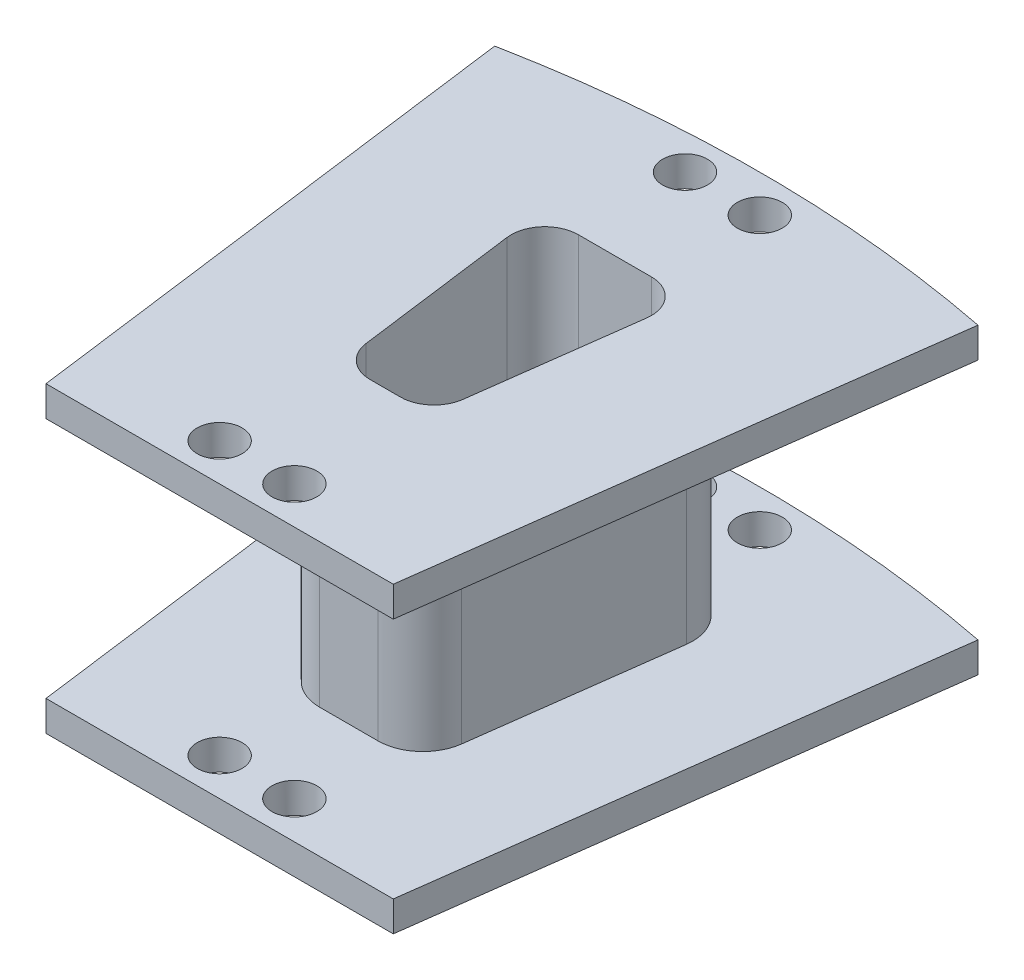
ISO-10303-21;
HEADER;
FILE_DESCRIPTION(('STEP AP214'),'2;1');
FILE_NAME('part.step','',(''),(''),'','','');
FILE_SCHEMA(('AUTOMOTIVE_DESIGN { 1 0 10303 214 1 1 1 1 }'));
ENDSEC;
DATA;
#1=APPLICATION_CONTEXT('core data for automotive mechanical design processes');
#2=APPLICATION_PROTOCOL_DEFINITION('international standard','automotive_design',2000,#1);
#3=PRODUCT_CONTEXT('',#1,'mechanical');
#4=PRODUCT('Part','Part','',(#3));
#5=PRODUCT_RELATED_PRODUCT_CATEGORY('part','',(#4));
#6=PRODUCT_DEFINITION_FORMATION('','',#4);
#7=PRODUCT_DEFINITION_CONTEXT('part definition',#1,'design');
#8=PRODUCT_DEFINITION('design','',#6,#7);
#9=PRODUCT_DEFINITION_SHAPE('','',#8);
#10=(LENGTH_UNIT() NAMED_UNIT(*) SI_UNIT(.MILLI.,.METRE.));
#11=(NAMED_UNIT(*) PLANE_ANGLE_UNIT() SI_UNIT($,.RADIAN.));
#12=(NAMED_UNIT(*) SI_UNIT($,.STERADIAN.) SOLID_ANGLE_UNIT());
#13=UNCERTAINTY_MEASURE_WITH_UNIT(LENGTH_MEASURE(1.E-05),#10,'distance_accuracy_value','');
#14=(GEOMETRIC_REPRESENTATION_CONTEXT(3) GLOBAL_UNCERTAINTY_ASSIGNED_CONTEXT((#13)) GLOBAL_UNIT_ASSIGNED_CONTEXT((#10,
#11,#12)) REPRESENTATION_CONTEXT('',''));
#15=CARTESIAN_POINT('',(0.,0.,0.));
#16=DIRECTION('',(0.,0.,1.));
#17=DIRECTION('',(1.,0.,0.));
#18=AXIS2_PLACEMENT_3D('',#15,#16,#17);
#19=CARTESIAN_POINT('',(0.,29.4,64.5794683780643));
#20=DIRECTION('',(0.,-1.,0.));
#21=DIRECTION('',(0.,0.,-1.));
#22=AXIS2_PLACEMENT_3D('',#19,#20,#21);
#23=PLANE('',#22);
#24=CARTESIAN_POINT('',(-2.5,29.4,-16.8905316219357));
#25=DIRECTION('',(0.,-1.,0.));
#26=DIRECTION('',(0.,0.,-1.));
#27=AXIS2_PLACEMENT_3D('',#24,#25,#26);
#28=CIRCLE('',#27,1.5);
#29=CARTESIAN_POINT('',(-2.5,29.4,-18.3905316219357));
#30=VERTEX_POINT('',#29);
#31=EDGE_CURVE('E240',#30,#30,#28,.T.);
#32=ORIENTED_EDGE('',*,*,#31,.T.);
#33=EDGE_LOOP('',(#32));
#34=FACE_BOUND('',#33,.T.);
#35=CARTESIAN_POINT('',(2.5,29.4,-16.8905316219357));
#36=DIRECTION('',(0.,-1.,0.));
#37=DIRECTION('',(0.,0.,-1.));
#38=AXIS2_PLACEMENT_3D('',#35,#36,#37);
#39=CIRCLE('',#38,1.5);
#40=CARTESIAN_POINT('',(2.5,29.4,-18.3905316219357));
#41=VERTEX_POINT('',#40);
#42=EDGE_CURVE('E235',#41,#41,#39,.F.);
#43=ORIENTED_EDGE('',*,*,#42,.F.);
#44=EDGE_LOOP('',(#43));
#45=FACE_BOUND('',#44,.T.);
#46=DIRECTION('',(0.130526192220052,0.,-0.99144486137381));
#47=VECTOR('',#46,1.);
#48=CARTESIAN_POINT('',(5.74945919012096,29.4,-0.813600959779443));
#49=LINE('',#48,#47);
#50=CARTESIAN_POINT('',(4.92098819359893,29.4,5.4792610193263));
#51=VERTEX_POINT('',#50);
#52=CARTESIAN_POINT('',(6.66991835020138,29.4,-7.8051824105558));
#53=VERTEX_POINT('',#52);
#54=EDGE_CURVE('E351',#51,#53,#49,.T.);
#55=ORIENTED_EDGE('',*,*,#54,.F.);
#56=CARTESIAN_POINT('',(1.9466536094775,29.4,5.08768244266614));
#57=DIRECTION('',(0.,-1.,0.));
#58=DIRECTION('',(0.,0.,-1.));
#59=AXIS2_PLACEMENT_3D('',#56,#57,#58);
#60=CIRCLE('',#59,3.);
#61=CARTESIAN_POINT('',(1.9466536094775,29.4,8.08768244266614));
#62=VERTEX_POINT('',#61);
#63=EDGE_CURVE('E201',#51,#62,#60,.T.);
#64=ORIENTED_EDGE('',*,*,#63,.T.);
#65=DIRECTION('',(1.,0.,0.));
#66=VECTOR('',#65,1.);
#67=CARTESIAN_POINT('',(0.,29.4,8.08768244266614));
#68=LINE('',#67,#66);
#69=CARTESIAN_POINT('',(-1.94665360947768,29.4,8.08768244266614));
#70=VERTEX_POINT('',#69);
#71=EDGE_CURVE('E352',#70,#62,#68,.T.);
#72=ORIENTED_EDGE('',*,*,#71,.F.);
#73=CARTESIAN_POINT('',(-1.94665360947768,29.4,5.08768244266614));
#74=DIRECTION('',(0.,-1.,0.));
#75=DIRECTION('',(0.,0.,-1.));
#76=AXIS2_PLACEMENT_3D('',#73,#74,#75);
#77=CIRCLE('',#76,3.);
#78=CARTESIAN_POINT('',(-4.92098819359911,29.4,5.4792610193263));
#79=VERTEX_POINT('',#78);
#80=EDGE_CURVE('E413',#70,#79,#77,.T.);
#81=ORIENTED_EDGE('',*,*,#80,.T.);
#82=DIRECTION('',(0.130526192220052,0.,0.99144486137381));
#83=VECTOR('',#82,1.);
#84=CARTESIAN_POINT('',(-5.74945919012115,29.4,-0.813600959779442));
#85=LINE('',#84,#83);
#86=CARTESIAN_POINT('',(-6.66991835020157,29.4,-7.80518241055579));
#87=VERTEX_POINT('',#86);
#88=EDGE_CURVE('E362',#87,#79,#85,.T.);
#89=ORIENTED_EDGE('',*,*,#88,.F.);
#90=CARTESIAN_POINT('',(-3.69558376608014,29.4,-8.19676098721595));
#91=DIRECTION('',(0.,-1.,0.));
#92=DIRECTION('',(0.,0.,-1.));
#93=AXIS2_PLACEMENT_3D('',#90,#91,#92);
#94=CIRCLE('',#93,3.);
#95=CARTESIAN_POINT('',(-3.84772801334568,29.4,-11.1929005246915));
#96=VERTEX_POINT('',#95);
#97=EDGE_CURVE('E217',#87,#96,#94,.T.);
#98=ORIENTED_EDGE('',*,*,#97,.T.);
#99=CARTESIAN_POINT('',(0.,29.4,64.5794683780643));
#100=DIRECTION('',(0.,1.,0.));
#101=DIRECTION('',(0.,0.,1.));
#102=AXIS2_PLACEMENT_3D('',#99,#100,#101);
#103=CIRCLE('',#102,75.87);
#104=CARTESIAN_POINT('',(3.84772801334549,29.4,-11.1929005246915));
#105=VERTEX_POINT('',#104);
#106=EDGE_CURVE('E198',#105,#96,#103,.T.);
#107=ORIENTED_EDGE('',*,*,#106,.F.);
#108=CARTESIAN_POINT('',(3.69558376607995,29.4,-8.19676098721596));
#109=DIRECTION('',(0.,-1.,0.));
#110=DIRECTION('',(0.,0.,-1.));
#111=AXIS2_PLACEMENT_3D('',#108,#109,#110);
#112=CIRCLE('',#111,3.);
#113=EDGE_CURVE('E216',#105,#53,#112,.T.);
#114=ORIENTED_EDGE('',*,*,#113,.T.);
#115=EDGE_LOOP('',(#55,#64,#72,#81,#89,#98,#107,#114));
#116=FACE_BOUND('',#115,.T.);
#117=CARTESIAN_POINT('',(0.,29.4,64.5794683780643));
#118=DIRECTION('',(0.,1.,0.));
#119=DIRECTION('',(0.,0.,-1.));
#120=AXIS2_PLACEMENT_3D('',#117,#118,#119);
#121=CIRCLE('',#120,83.97);
#122=CARTESIAN_POINT('',(16.1584430430325,29.4,-17.821172507945));
#123=VERTEX_POINT('',#122);
#124=CARTESIAN_POINT('',(-16.1584430430327,29.4,-17.821172507945));
#125=VERTEX_POINT('',#124);
#126=EDGE_CURVE('E367',#123,#125,#121,.T.);
#127=ORIENTED_EDGE('',*,*,#126,.T.);
#128=DIRECTION('',(0.130526192220052,0.,0.99144486137381));
#129=VECTOR('',#128,1.);
#130=CARTESIAN_POINT('',(-16.1584430430327,29.4,-17.821172507945));
#131=LINE('',#130,#129);
#132=CARTESIAN_POINT('',(-11.6100000000001,29.4,16.7276824426661));
#133=VERTEX_POINT('',#132);
#134=EDGE_CURVE('E370',#125,#133,#131,.T.);
#135=ORIENTED_EDGE('',*,*,#134,.T.);
#136=DIRECTION('',(1.,0.,0.));
#137=VECTOR('',#136,1.);
#138=CARTESIAN_POINT('',(-11.6100000000001,29.4,16.7276824426661));
#139=LINE('',#138,#137);
#140=CARTESIAN_POINT('',(11.6099999999999,29.4,16.7276824426661));
#141=VERTEX_POINT('',#140);
#142=EDGE_CURVE('E373',#133,#141,#139,.T.);
#143=ORIENTED_EDGE('',*,*,#142,.T.);
#144=DIRECTION('',(0.130526192220052,0.,-0.99144486137381));
#145=VECTOR('',#144,1.);
#146=CARTESIAN_POINT('',(16.1584430430325,29.4,-17.821172507945));
#147=LINE('',#146,#145);
#148=EDGE_CURVE('E375',#141,#123,#147,.T.);
#149=ORIENTED_EDGE('',*,*,#148,.T.);
#150=EDGE_LOOP('',(#127,#135,#143,#149));
#151=FACE_BOUND('',#150,.T.);
#152=CARTESIAN_POINT('',(-2.5,29.4,14.2276824426661));
#153=DIRECTION('',(0.,-1.,0.));
#154=DIRECTION('',(0.,0.,-1.));
#155=AXIS2_PLACEMENT_3D('',#152,#153,#154);
#156=CIRCLE('',#155,1.5);
#157=CARTESIAN_POINT('',(-2.5,29.4,12.7276824426661));
#158=VERTEX_POINT('',#157);
#159=EDGE_CURVE('E245',#158,#158,#156,.F.);
#160=ORIENTED_EDGE('',*,*,#159,.F.);
#161=EDGE_LOOP('',(#160));
#162=FACE_BOUND('',#161,.T.);
#163=CARTESIAN_POINT('',(2.5,29.4,14.2276824426661));
#164=DIRECTION('',(0.,-1.,0.));
#165=DIRECTION('',(0.,0.,-1.));
#166=AXIS2_PLACEMENT_3D('',#163,#164,#165);
#167=CIRCLE('',#166,1.5);
#168=CARTESIAN_POINT('',(2.5,29.4,12.7276824426661));
#169=VERTEX_POINT('',#168);
#170=EDGE_CURVE('E318',#169,#169,#167,.T.);
#171=ORIENTED_EDGE('',*,*,#170,.T.);
#172=EDGE_LOOP('',(#171));
#173=FACE_BOUND('',#172,.T.);
#174=ADVANCED_FACE('F40',(#34,#45,#116,#151,#162,#173),#23,.F.);
#175=CARTESIAN_POINT('',(0.,27.375,64.5794683780643));
#176=DIRECTION('',(0.,-1.,0.));
#177=DIRECTION('',(0.,0.,-1.));
#178=AXIS2_PLACEMENT_3D('',#175,#176,#177);
#179=PLANE('',#178);
#180=CARTESIAN_POINT('',(2.5,27.375,14.2276824426661));
#181=DIRECTION('',(0.,1.,0.));
#182=DIRECTION('',(0.,0.,1.));
#183=AXIS2_PLACEMENT_3D('',#180,#181,#182);
#184=CIRCLE('',#183,1.5);
#185=CARTESIAN_POINT('',(2.5,27.375,15.7276824426661));
#186=VERTEX_POINT('',#185);
#187=EDGE_CURVE('E778',#186,#186,#184,.T.);
#188=ORIENTED_EDGE('',*,*,#187,.T.);
#189=EDGE_LOOP('',(#188));
#190=FACE_BOUND('',#189,.T.);
#191=CARTESIAN_POINT('',(2.5,27.375,-16.8905316219357));
#192=DIRECTION('',(0.,-1.,0.));
#193=DIRECTION('',(0.,0.,-1.));
#194=AXIS2_PLACEMENT_3D('',#191,#192,#193);
#195=CIRCLE('',#194,1.5);
#196=CARTESIAN_POINT('',(2.5,27.375,-18.3905316219357));
#197=VERTEX_POINT('',#196);
#198=EDGE_CURVE('E773',#197,#197,#195,.T.);
#199=ORIENTED_EDGE('',*,*,#198,.F.);
#200=EDGE_LOOP('',(#199));
#201=FACE_BOUND('',#200,.T.);
#202=CARTESIAN_POINT('',(0.,27.375,64.5794683780643));
#203=DIRECTION('',(0.,1.,0.));
#204=DIRECTION('',(0.,0.,-1.));
#205=AXIS2_PLACEMENT_3D('',#202,#203,#204);
#206=CIRCLE('',#205,83.97);
#207=CARTESIAN_POINT('',(16.1584430430325,27.375,-17.821172507945));
#208=VERTEX_POINT('',#207);
#209=CARTESIAN_POINT('',(-16.1584430430327,27.375,-17.821172507945));
#210=VERTEX_POINT('',#209);
#211=EDGE_CURVE('E358',#208,#210,#206,.T.);
#212=ORIENTED_EDGE('',*,*,#211,.F.);
#213=DIRECTION('',(0.130526192220052,0.,-0.99144486137381));
#214=VECTOR('',#213,1.);
#215=CARTESIAN_POINT('',(16.1584430430325,27.375,-17.821172507945));
#216=LINE('',#215,#214);
#217=CARTESIAN_POINT('',(11.6099999999999,27.375,16.7276824426661));
#218=VERTEX_POINT('',#217);
#219=EDGE_CURVE('E371',#218,#208,#216,.T.);
#220=ORIENTED_EDGE('',*,*,#219,.F.);
#221=DIRECTION('',(1.,0.,0.));
#222=VECTOR('',#221,1.);
#223=CARTESIAN_POINT('',(-11.6100000000001,27.375,16.7276824426661));
#224=LINE('',#223,#222);
#225=CARTESIAN_POINT('',(-11.6100000000001,27.375,16.7276824426661));
#226=VERTEX_POINT('',#225);
#227=EDGE_CURVE('E382',#226,#218,#224,.T.);
#228=ORIENTED_EDGE('',*,*,#227,.F.);
#229=DIRECTION('',(0.130526192220052,0.,0.99144486137381));
#230=VECTOR('',#229,1.);
#231=CARTESIAN_POINT('',(-16.1584430430327,27.375,-17.821172507945));
#232=LINE('',#231,#230);
#233=EDGE_CURVE('E380',#210,#226,#232,.T.);
#234=ORIENTED_EDGE('',*,*,#233,.F.);
#235=EDGE_LOOP('',(#212,#220,#228,#234));
#236=FACE_BOUND('',#235,.T.);
#237=DIRECTION('',(1.,0.,0.));
#238=VECTOR('',#237,1.);
#239=CARTESIAN_POINT('',(0.,27.375,5.65231696991796));
#240=LINE('',#239,#238);
#241=CARTESIAN_POINT('',(-1.00861259292,27.375,5.65231696991796));
#242=VERTEX_POINT('',#241);
#243=CARTESIAN_POINT('',(1.00861259292,27.375,5.65231696991796));
#244=VERTEX_POINT('',#243);
#245=EDGE_CURVE('E294',#242,#244,#240,.T.);
#246=ORIENTED_EDGE('',*,*,#245,.T.);
#247=CARTESIAN_POINT('',(1.00861259292,27.375,3.40231914021618));
#248=DIRECTION('',(0.,1.,0.));
#249=DIRECTION('',(0.,0.,1.));
#250=AXIS2_PLACEMENT_3D('',#247,#248,#249);
#251=CIRCLE('',#250,2.24999891485089);
#252=CARTESIAN_POINT('',(3.23936353101107,27.375,3.6960030727113));
#253=VERTEX_POINT('',#252);
#254=EDGE_CURVE('E287',#253,#244,#251,.F.);
#255=ORIENTED_EDGE('',*,*,#254,.F.);
#256=DIRECTION('',(0.130526192220052,0.,-0.99144486137381));
#257=VECTOR('',#256,1.);
#258=CARTESIAN_POINT('',(3.66247220616437,27.375,0.482173613285959));
#259=LINE('',#258,#257);
#260=CARTESIAN_POINT('',(4.66792878506691,27.375,-7.15502733107955));
#261=VERTEX_POINT('',#260);
#262=EDGE_CURVE('E765',#253,#261,#259,.T.);
#263=ORIENTED_EDGE('',*,*,#262,.T.);
#264=CARTESIAN_POINT('',(2.43717784697583,27.375,-7.44871126357467));
#265=DIRECTION('',(0.,1.,0.));
#266=DIRECTION('',(0.,0.,1.));
#267=AXIS2_PLACEMENT_3D('',#264,#265,#266);
#268=CIRCLE('',#267,2.25);
#269=CARTESIAN_POINT('',(2.43717784697602,27.375,-9.69871126357467));
#270=VERTEX_POINT('',#269);
#271=EDGE_CURVE('E761',#270,#261,#268,.F.);
#272=ORIENTED_EDGE('',*,*,#271,.F.);
#273=DIRECTION('',(1.,0.,0.));
#274=VECTOR('',#273,1.);
#275=CARTESIAN_POINT('',(0.,27.375,-9.69871126357467));
#276=LINE('',#275,#274);
#277=CARTESIAN_POINT('',(-2.43717784697602,27.375,-9.69871126357467));
#278=VERTEX_POINT('',#277);
#279=EDGE_CURVE('E755',#278,#270,#276,.T.);
#280=ORIENTED_EDGE('',*,*,#279,.F.);
#281=CARTESIAN_POINT('',(-2.43717784697602,27.375,-7.44871126357467));
#282=DIRECTION('',(0.,1.,0.));
#283=DIRECTION('',(0.,0.,1.));
#284=AXIS2_PLACEMENT_3D('',#281,#282,#283);
#285=CIRCLE('',#284,2.25);
#286=CARTESIAN_POINT('',(-4.6679287850671,27.375,-7.15502733107955));
#287=VERTEX_POINT('',#286);
#288=EDGE_CURVE('E760',#287,#278,#285,.F.);
#289=ORIENTED_EDGE('',*,*,#288,.F.);
#290=DIRECTION('',(0.130526192220052,0.,0.99144486137381));
#291=VECTOR('',#290,1.);
#292=CARTESIAN_POINT('',(-3.66247220616455,27.375,0.482173613285985));
#293=LINE('',#292,#291);
#294=CARTESIAN_POINT('',(-3.23936381673644,27.375,3.6960009024131));
#295=VERTEX_POINT('',#294);
#296=EDGE_CURVE('E771',#287,#295,#293,.T.);
#297=ORIENTED_EDGE('',*,*,#296,.T.);
#298=CARTESIAN_POINT('',(-1.00861287864537,27.375,3.40231696991798));
#299=DIRECTION('',(0.,1.,0.));
#300=DIRECTION('',(0.,0.,1.));
#301=AXIS2_PLACEMENT_3D('',#298,#299,#300);
#302=CIRCLE('',#301,2.25);
#303=EDGE_CURVE('E272',#295,#242,#302,.T.);
#304=ORIENTED_EDGE('',*,*,#303,.T.);
#305=EDGE_LOOP('',(#246,#255,#263,#272,#280,#289,#297,#304));
#306=FACE_BOUND('',#305,.T.);
#307=CARTESIAN_POINT('',(-2.5,27.375,-16.8905316219357));
#308=DIRECTION('',(0.,1.,0.));
#309=DIRECTION('',(0.,0.,1.));
#310=AXIS2_PLACEMENT_3D('',#307,#308,#309);
#311=CIRCLE('',#310,1.5);
#312=CARTESIAN_POINT('',(-2.5,27.375,-15.3905316219357));
#313=VERTEX_POINT('',#312);
#314=EDGE_CURVE('E775',#313,#313,#311,.T.);
#315=ORIENTED_EDGE('',*,*,#314,.T.);
#316=EDGE_LOOP('',(#315));
#317=FACE_BOUND('',#316,.T.);
#318=CARTESIAN_POINT('',(-2.5,27.375,14.2276824426661));
#319=DIRECTION('',(0.,-1.,0.));
#320=DIRECTION('',(0.,0.,-1.));
#321=AXIS2_PLACEMENT_3D('',#318,#319,#320);
#322=CIRCLE('',#321,1.5);
#323=CARTESIAN_POINT('',(-2.5,27.375,12.7276824426661));
#324=VERTEX_POINT('',#323);
#325=EDGE_CURVE('E781',#324,#324,#322,.T.);
#326=ORIENTED_EDGE('',*,*,#325,.F.);
#327=EDGE_LOOP('',(#326));
#328=FACE_BOUND('',#327,.T.);
#329=ADVANCED_FACE('F442',(#190,#201,#236,#306,#317,#328),#179,.T.);
#330=CARTESIAN_POINT('',(0.,45.6,64.5794683780643));
#331=DIRECTION('',(0.,1.,0.));
#332=DIRECTION('',(0.,0.,-1.));
#333=AXIS2_PLACEMENT_3D('',#330,#331,#332);
#334=PLANE('',#333);
#335=CARTESIAN_POINT('',(-2.5,45.6,-16.8905316219357));
#336=DIRECTION('',(0.,1.,0.));
#337=DIRECTION('',(0.,0.,1.));
#338=AXIS2_PLACEMENT_3D('',#335,#336,#337);
#339=CIRCLE('',#338,1.5);
#340=CARTESIAN_POINT('',(-2.5,45.6,-15.3905316219357));
#341=VERTEX_POINT('',#340);
#342=EDGE_CURVE('E234',#341,#341,#339,.T.);
#343=ORIENTED_EDGE('',*,*,#342,.T.);
#344=EDGE_LOOP('',(#343));
#345=FACE_BOUND('',#344,.T.);
#346=CARTESIAN_POINT('',(2.5,45.6,-16.8905316219357));
#347=DIRECTION('',(0.,1.,0.));
#348=DIRECTION('',(0.,0.,1.));
#349=AXIS2_PLACEMENT_3D('',#346,#347,#348);
#350=CIRCLE('',#349,1.5);
#351=CARTESIAN_POINT('',(2.5,45.6,-15.3905316219357));
#352=VERTEX_POINT('',#351);
#353=EDGE_CURVE('E229',#352,#352,#350,.F.);
#354=ORIENTED_EDGE('',*,*,#353,.F.);
#355=EDGE_LOOP('',(#354));
#356=FACE_BOUND('',#355,.T.);
#357=CARTESIAN_POINT('',(0.,45.6,64.5794683780643));
#358=DIRECTION('',(0.,1.,0.));
#359=DIRECTION('',(0.,0.,-1.));
#360=AXIS2_PLACEMENT_3D('',#357,#358,#359);
#361=CIRCLE('',#360,83.97);
#362=CARTESIAN_POINT('',(16.1584430430325,45.6,-17.821172507945));
#363=VERTEX_POINT('',#362);
#364=CARTESIAN_POINT('',(-16.1584430430327,45.6,-17.821172507945));
#365=VERTEX_POINT('',#364);
#366=EDGE_CURVE('E322',#363,#365,#361,.T.);
#367=ORIENTED_EDGE('',*,*,#366,.F.);
#368=DIRECTION('',(0.130526192220052,0.,-0.99144486137381));
#369=VECTOR('',#368,1.);
#370=CARTESIAN_POINT('',(16.1584430430325,45.6,-17.821172507945));
#371=LINE('',#370,#369);
#372=CARTESIAN_POINT('',(11.6099999999999,45.6,16.7276824426661));
#373=VERTEX_POINT('',#372);
#374=EDGE_CURVE('E325',#373,#363,#371,.T.);
#375=ORIENTED_EDGE('',*,*,#374,.F.);
#376=DIRECTION('',(1.,0.,0.));
#377=VECTOR('',#376,1.);
#378=CARTESIAN_POINT('',(-11.6100000000001,45.6,16.7276824426661));
#379=LINE('',#378,#377);
#380=CARTESIAN_POINT('',(-11.6100000000001,45.6,16.7276824426661));
#381=VERTEX_POINT('',#380);
#382=EDGE_CURVE('E328',#381,#373,#379,.T.);
#383=ORIENTED_EDGE('',*,*,#382,.F.);
#384=DIRECTION('',(0.130526192220052,0.,0.99144486137381));
#385=VECTOR('',#384,1.);
#386=CARTESIAN_POINT('',(-16.1584430430327,45.6,-17.821172507945));
#387=LINE('',#386,#385);
#388=EDGE_CURVE('E331',#365,#381,#387,.T.);
#389=ORIENTED_EDGE('',*,*,#388,.F.);
#390=EDGE_LOOP('',(#367,#375,#383,#389));
#391=FACE_BOUND('',#390,.T.);
#392=DIRECTION('',(0.130526192220052,0.,0.99144486137381));
#393=VECTOR('',#392,1.);
#394=CARTESIAN_POINT('',(-5.74945919012115,45.6,-0.813600959779442));
#395=LINE('',#394,#393);
#396=CARTESIAN_POINT('',(-6.66991835020157,45.6,-7.80518241055579));
#397=VERTEX_POINT('',#396);
#398=CARTESIAN_POINT('',(-4.92098819359911,45.6,5.4792610193263));
#399=VERTEX_POINT('',#398);
#400=EDGE_CURVE('E209',#397,#399,#395,.T.);
#401=ORIENTED_EDGE('',*,*,#400,.T.);
#402=CARTESIAN_POINT('',(-1.94665360947768,45.6,5.08768244266614));
#403=DIRECTION('',(0.,1.,0.));
#404=DIRECTION('',(0.,0.,1.));
#405=AXIS2_PLACEMENT_3D('',#402,#403,#404);
#406=CIRCLE('',#405,3.);
#407=CARTESIAN_POINT('',(-1.94665360947768,45.6,8.08768244266614));
#408=VERTEX_POINT('',#407);
#409=EDGE_CURVE('E220',#399,#408,#406,.T.);
#410=ORIENTED_EDGE('',*,*,#409,.T.);
#411=DIRECTION('',(1.,0.,0.));
#412=VECTOR('',#411,1.);
#413=CARTESIAN_POINT('',(0.,45.6,8.08768244266614));
#414=LINE('',#413,#412);
#415=CARTESIAN_POINT('',(1.9466536094775,45.6,8.08768244266614));
#416=VERTEX_POINT('',#415);
#417=EDGE_CURVE('E355',#408,#416,#414,.T.);
#418=ORIENTED_EDGE('',*,*,#417,.T.);
#419=CARTESIAN_POINT('',(1.9466536094775,45.6,5.08768244266614));
#420=DIRECTION('',(0.,1.,0.));
#421=DIRECTION('',(0.,0.,1.));
#422=AXIS2_PLACEMENT_3D('',#419,#420,#421);
#423=CIRCLE('',#422,3.);
#424=CARTESIAN_POINT('',(4.92098819359893,45.6,5.4792610193263));
#425=VERTEX_POINT('',#424);
#426=EDGE_CURVE('E411',#416,#425,#423,.T.);
#427=ORIENTED_EDGE('',*,*,#426,.T.);
#428=DIRECTION('',(0.130526192220052,0.,-0.99144486137381));
#429=VECTOR('',#428,1.);
#430=CARTESIAN_POINT('',(5.74945919012096,45.6,-0.813600959779443));
#431=LINE('',#430,#429);
#432=CARTESIAN_POINT('',(6.66991835020138,45.6,-7.8051824105558));
#433=VERTEX_POINT('',#432);
#434=EDGE_CURVE('E210',#425,#433,#431,.T.);
#435=ORIENTED_EDGE('',*,*,#434,.T.);
#436=CARTESIAN_POINT('',(3.69558376607995,45.6,-8.19676098721596));
#437=DIRECTION('',(0.,1.,0.));
#438=DIRECTION('',(0.,0.,1.));
#439=AXIS2_PLACEMENT_3D('',#436,#437,#438);
#440=CIRCLE('',#439,3.);
#441=CARTESIAN_POINT('',(3.84772801334549,45.6,-11.1929005246915));
#442=VERTEX_POINT('',#441);
#443=EDGE_CURVE('E186',#433,#442,#440,.T.);
#444=ORIENTED_EDGE('',*,*,#443,.T.);
#445=CARTESIAN_POINT('',(0.,45.6,64.5794683780643));
#446=DIRECTION('',(0.,1.,0.));
#447=DIRECTION('',(0.,0.,1.));
#448=AXIS2_PLACEMENT_3D('',#445,#446,#447);
#449=CIRCLE('',#448,75.87);
#450=CARTESIAN_POINT('',(-3.84772801334568,45.6,-11.1929005246915));
#451=VERTEX_POINT('',#450);
#452=EDGE_CURVE('E195',#442,#451,#449,.T.);
#453=ORIENTED_EDGE('',*,*,#452,.T.);
#454=CARTESIAN_POINT('',(-3.69558376608014,45.6,-8.19676098721595));
#455=DIRECTION('',(0.,1.,0.));
#456=DIRECTION('',(0.,0.,1.));
#457=AXIS2_PLACEMENT_3D('',#454,#455,#456);
#458=CIRCLE('',#457,3.);
#459=EDGE_CURVE('E207',#451,#397,#458,.T.);
#460=ORIENTED_EDGE('',*,*,#459,.T.);
#461=EDGE_LOOP('',(#401,#410,#418,#427,#435,#444,#453,#460));
#462=FACE_BOUND('',#461,.T.);
#463=CARTESIAN_POINT('',(-2.5,45.6,14.2276824426661));
#464=DIRECTION('',(0.,1.,0.));
#465=DIRECTION('',(0.,0.,1.));
#466=AXIS2_PLACEMENT_3D('',#463,#464,#465);
#467=CIRCLE('',#466,1.5);
#468=CARTESIAN_POINT('',(-2.5,45.6,15.7276824426661));
#469=VERTEX_POINT('',#468);
#470=EDGE_CURVE('E239',#469,#469,#467,.F.);
#471=ORIENTED_EDGE('',*,*,#470,.F.);
#472=EDGE_LOOP('',(#471));
#473=FACE_BOUND('',#472,.T.);
#474=CARTESIAN_POINT('',(2.5,45.6,14.2276824426661));
#475=DIRECTION('',(0.,1.,0.));
#476=DIRECTION('',(0.,0.,1.));
#477=AXIS2_PLACEMENT_3D('',#474,#475,#476);
#478=CIRCLE('',#477,1.5);
#479=CARTESIAN_POINT('',(2.5,45.6,15.7276824426661));
#480=VERTEX_POINT('',#479);
#481=EDGE_CURVE('E244',#480,#480,#478,.T.);
#482=ORIENTED_EDGE('',*,*,#481,.T.);
#483=EDGE_LOOP('',(#482));
#484=FACE_BOUND('',#483,.T.);
#485=ADVANCED_FACE('F205',(#345,#356,#391,#462,#473,#484),#334,.F.);
#486=CARTESIAN_POINT('',(0.,47.625,64.5794683780643));
#487=DIRECTION('',(0.,1.,0.));
#488=DIRECTION('',(0.,0.,-1.));
#489=AXIS2_PLACEMENT_3D('',#486,#487,#488);
#490=PLANE('',#489);
#491=CARTESIAN_POINT('',(2.5,47.625,14.2276824426661));
#492=DIRECTION('',(0.,1.,0.));
#493=DIRECTION('',(0.,0.,1.));
#494=AXIS2_PLACEMENT_3D('',#491,#492,#493);
#495=CIRCLE('',#494,1.5);
#496=CARTESIAN_POINT('',(2.5,47.625,15.7276824426661));
#497=VERTEX_POINT('',#496);
#498=EDGE_CURVE('E241',#497,#497,#495,.T.);
#499=ORIENTED_EDGE('',*,*,#498,.F.);
#500=EDGE_LOOP('',(#499));
#501=FACE_BOUND('',#500,.T.);
#502=CARTESIAN_POINT('',(2.5,47.625,-16.8905316219357));
#503=DIRECTION('',(0.,1.,0.));
#504=DIRECTION('',(0.,0.,1.));
#505=AXIS2_PLACEMENT_3D('',#502,#503,#504);
#506=CIRCLE('',#505,1.5);
#507=CARTESIAN_POINT('',(2.5,47.625,-15.3905316219357));
#508=VERTEX_POINT('',#507);
#509=EDGE_CURVE('E226',#508,#508,#506,.F.);
#510=ORIENTED_EDGE('',*,*,#509,.T.);
#511=EDGE_LOOP('',(#510));
#512=FACE_BOUND('',#511,.T.);
#513=CARTESIAN_POINT('',(0.,47.625,64.5794683780643));
#514=DIRECTION('',(0.,1.,0.));
#515=DIRECTION('',(0.,0.,-1.));
#516=AXIS2_PLACEMENT_3D('',#513,#514,#515);
#517=CIRCLE('',#516,83.97);
#518=CARTESIAN_POINT('',(16.1584430430325,47.625,-17.821172507945));
#519=VERTEX_POINT('',#518);
#520=CARTESIAN_POINT('',(-16.1584430430327,47.625,-17.821172507945));
#521=VERTEX_POINT('',#520);
#522=EDGE_CURVE('E321',#519,#521,#517,.T.);
#523=ORIENTED_EDGE('',*,*,#522,.T.);
#524=DIRECTION('',(0.130526192220052,0.,0.99144486137381));
#525=VECTOR('',#524,1.);
#526=CARTESIAN_POINT('',(-16.1584430430327,47.625,-17.821172507945));
#527=LINE('',#526,#525);
#528=CARTESIAN_POINT('',(-11.6100000000001,47.625,16.7276824426661));
#529=VERTEX_POINT('',#528);
#530=EDGE_CURVE('E326',#521,#529,#527,.T.);
#531=ORIENTED_EDGE('',*,*,#530,.T.);
#532=DIRECTION('',(1.,0.,0.));
#533=VECTOR('',#532,1.);
#534=CARTESIAN_POINT('',(-11.6100000000001,47.625,16.7276824426661));
#535=LINE('',#534,#533);
#536=CARTESIAN_POINT('',(11.6099999999999,47.625,16.7276824426661));
#537=VERTEX_POINT('',#536);
#538=EDGE_CURVE('E340',#529,#537,#535,.T.);
#539=ORIENTED_EDGE('',*,*,#538,.T.);
#540=DIRECTION('',(0.130526192220052,0.,-0.99144486137381));
#541=VECTOR('',#540,1.);
#542=CARTESIAN_POINT('',(16.1584430430325,47.625,-17.821172507945));
#543=LINE('',#542,#541);
#544=EDGE_CURVE('E337',#537,#519,#543,.T.);
#545=ORIENTED_EDGE('',*,*,#544,.T.);
#546=EDGE_LOOP('',(#523,#531,#539,#545));
#547=FACE_BOUND('',#546,.T.);
#548=DIRECTION('',(0.130526192220052,0.,-0.99144486137381));
#549=VECTOR('',#548,1.);
#550=CARTESIAN_POINT('',(3.66247220616437,47.625,0.482173613285959));
#551=LINE('',#550,#549);
#552=CARTESIAN_POINT('',(3.23936299307832,47.625,3.69600300189111));
#553=VERTEX_POINT('',#552);
#554=CARTESIAN_POINT('',(4.66792878506691,47.625,-7.15502733107955));
#555=VERTEX_POINT('',#554);
#556=EDGE_CURVE('E225',#553,#555,#551,.T.);
#557=ORIENTED_EDGE('',*,*,#556,.F.);
#558=CARTESIAN_POINT('',(1.00861259292,47.625,3.40231914021618));
#559=DIRECTION('',(0.,1.,0.));
#560=DIRECTION('',(0.,0.,1.));
#561=AXIS2_PLACEMENT_3D('',#558,#559,#560);
#562=CIRCLE('',#561,2.24999891485089);
#563=CARTESIAN_POINT('',(1.00861259292,47.625,5.65231751249252));
#564=VERTEX_POINT('',#563);
#565=EDGE_CURVE('E11',#553,#564,#562,.F.);
#566=ORIENTED_EDGE('',*,*,#565,.T.);
#567=DIRECTION('',(1.,0.,0.));
#568=VECTOR('',#567,1.);
#569=CARTESIAN_POINT('',(0.,47.625,5.65231696991796));
#570=LINE('',#569,#568);
#571=CARTESIAN_POINT('',(-1.00861273578268,47.625,5.65231696991796));
#572=VERTEX_POINT('',#571);
#573=EDGE_CURVE('E49',#572,#564,#570,.T.);
#574=ORIENTED_EDGE('',*,*,#573,.F.);
#575=CARTESIAN_POINT('',(-1.00861287864537,47.625,3.40231696991798));
#576=DIRECTION('',(0.,1.,0.));
#577=DIRECTION('',(0.,0.,1.));
#578=AXIS2_PLACEMENT_3D('',#575,#576,#577);
#579=CIRCLE('',#578,2.25);
#580=CARTESIAN_POINT('',(-3.23936381673644,47.625,3.6960009024131));
#581=VERTEX_POINT('',#580);
#582=EDGE_CURVE('E85',#581,#572,#579,.T.);
#583=ORIENTED_EDGE('',*,*,#582,.F.);
#584=DIRECTION('',(0.130526192220052,0.,0.99144486137381));
#585=VECTOR('',#584,1.);
#586=CARTESIAN_POINT('',(-3.66247220616455,47.625,0.482173613285985));
#587=LINE('',#586,#585);
#588=CARTESIAN_POINT('',(-4.6679287850671,47.625,-7.15502733107955));
#589=VERTEX_POINT('',#588);
#590=EDGE_CURVE('E256',#589,#581,#587,.T.);
#591=ORIENTED_EDGE('',*,*,#590,.F.);
#592=CARTESIAN_POINT('',(-2.43717784697602,47.625,-7.44871126357467));
#593=DIRECTION('',(0.,1.,0.));
#594=DIRECTION('',(0.,0.,1.));
#595=AXIS2_PLACEMENT_3D('',#592,#593,#594);
#596=CIRCLE('',#595,2.25);
#597=CARTESIAN_POINT('',(-2.43717784697602,47.625,-9.69871126357467));
#598=VERTEX_POINT('',#597);
#599=EDGE_CURVE('E253',#589,#598,#596,.F.);
#600=ORIENTED_EDGE('',*,*,#599,.T.);
#601=DIRECTION('',(-1.,0.,0.));
#602=VECTOR('',#601,1.);
#603=CARTESIAN_POINT('',(0.,47.625,-9.69871126357467));
#604=LINE('',#603,#602);
#605=CARTESIAN_POINT('',(2.43717784697593,47.625,-9.69871126357467));
#606=VERTEX_POINT('',#605);
#607=EDGE_CURVE('E250',#598,#606,#604,.F.);
#608=ORIENTED_EDGE('',*,*,#607,.T.);
#609=CARTESIAN_POINT('',(2.43717784697583,47.625,-7.44871126357467));
#610=DIRECTION('',(0.,1.,0.));
#611=DIRECTION('',(0.,0.,1.));
#612=AXIS2_PLACEMENT_3D('',#609,#610,#611);
#613=CIRCLE('',#612,2.25);
#614=EDGE_CURVE('E247',#606,#555,#613,.F.);
#615=ORIENTED_EDGE('',*,*,#614,.T.);
#616=EDGE_LOOP('',(#557,#566,#574,#583,#591,#600,#608,#615));
#617=FACE_BOUND('',#616,.T.);
#618=CARTESIAN_POINT('',(-2.5,47.625,-16.8905316219357));
#619=DIRECTION('',(0.,1.,0.));
#620=DIRECTION('',(0.,0.,1.));
#621=AXIS2_PLACEMENT_3D('',#618,#619,#620);
#622=CIRCLE('',#621,1.5);
#623=CARTESIAN_POINT('',(-2.5,47.625,-15.3905316219357));
#624=VERTEX_POINT('',#623);
#625=EDGE_CURVE('E231',#624,#624,#622,.T.);
#626=ORIENTED_EDGE('',*,*,#625,.F.);
#627=EDGE_LOOP('',(#626));
#628=FACE_BOUND('',#627,.T.);
#629=CARTESIAN_POINT('',(-2.5,47.625,14.2276824426661));
#630=DIRECTION('',(0.,1.,0.));
#631=DIRECTION('',(0.,0.,1.));
#632=AXIS2_PLACEMENT_3D('',#629,#630,#631);
#633=CIRCLE('',#632,1.5);
#634=CARTESIAN_POINT('',(-2.5,47.625,15.7276824426661));
#635=VERTEX_POINT('',#634);
#636=EDGE_CURVE('E236',#635,#635,#633,.F.);
#637=ORIENTED_EDGE('',*,*,#636,.T.);
#638=EDGE_LOOP('',(#637));
#639=FACE_BOUND('',#638,.T.);
#640=ADVANCED_FACE('F277',(#501,#512,#547,#617,#628,#639),#490,.T.);
#641=CARTESIAN_POINT('',(0.,29.4,64.5794683780643));
#642=DIRECTION('',(0.,-1.,0.));
#643=DIRECTION('',(0.,0.,-1.));
#644=AXIS2_PLACEMENT_3D('',#641,#642,#643);
#645=CYLINDRICAL_SURFACE('',#644,83.97);
#646=ORIENTED_EDGE('',*,*,#211,.T.);
#647=DIRECTION('',(0.,-1.,0.));
#648=VECTOR('',#647,1.);
#649=CARTESIAN_POINT('',(-16.1584430430327,29.4,-17.821172507945));
#650=LINE('',#649,#648);
#651=EDGE_CURVE('E393',#125,#210,#650,.T.);
#652=ORIENTED_EDGE('',*,*,#651,.F.);
#653=ORIENTED_EDGE('',*,*,#126,.F.);
#654=DIRECTION('',(0.,-1.,0.));
#655=VECTOR('',#654,1.);
#656=CARTESIAN_POINT('',(16.1584430430325,29.4,-17.821172507945));
#657=LINE('',#656,#655);
#658=EDGE_CURVE('E377',#123,#208,#657,.T.);
#659=ORIENTED_EDGE('',*,*,#658,.T.);
#660=EDGE_LOOP('',(#646,#652,#653,#659));
#661=FACE_BOUND('',#660,.T.);
#662=ADVANCED_FACE('F464',(#661),#645,.T.);
#663=CARTESIAN_POINT('',(-16.1584430430327,29.4,-17.821172507945));
#664=DIRECTION('',(0.99144486137381,0.,-0.130526192220052));
#665=DIRECTION('',(-0.130526192220052,0.,-0.99144486137381));
#666=AXIS2_PLACEMENT_3D('',#663,#664,#665);
#667=PLANE('',#666);
#668=ORIENTED_EDGE('',*,*,#233,.T.);
#669=DIRECTION('',(0.,-1.,0.));
#670=VECTOR('',#669,1.);
#671=CARTESIAN_POINT('',(-11.6100000000001,29.4,16.7276824426661));
#672=LINE('',#671,#670);
#673=EDGE_CURVE('E390',#133,#226,#672,.T.);
#674=ORIENTED_EDGE('',*,*,#673,.F.);
#675=ORIENTED_EDGE('',*,*,#134,.F.);
#676=ORIENTED_EDGE('',*,*,#651,.T.);
#677=EDGE_LOOP('',(#668,#674,#675,#676));
#678=FACE_BOUND('',#677,.T.);
#679=ADVANCED_FACE('F460',(#678),#667,.F.);
#680=CARTESIAN_POINT('',(-11.6100000000001,29.4,16.7276824426661));
#681=DIRECTION('',(0.,0.,-1.));
#682=DIRECTION('',(-1.,0.,0.));
#683=AXIS2_PLACEMENT_3D('',#680,#681,#682);
#684=PLANE('',#683);
#685=ORIENTED_EDGE('',*,*,#227,.T.);
#686=DIRECTION('',(0.,-1.,0.));
#687=VECTOR('',#686,1.);
#688=CARTESIAN_POINT('',(11.6099999999999,29.4,16.7276824426661));
#689=LINE('',#688,#687);
#690=EDGE_CURVE('E387',#141,#218,#689,.T.);
#691=ORIENTED_EDGE('',*,*,#690,.F.);
#692=ORIENTED_EDGE('',*,*,#142,.F.);
#693=ORIENTED_EDGE('',*,*,#673,.T.);
#694=EDGE_LOOP('',(#685,#691,#692,#693));
#695=FACE_BOUND('',#694,.T.);
#696=ADVANCED_FACE('F456',(#695),#684,.F.);
#697=CARTESIAN_POINT('',(16.1584430430325,29.4,-17.821172507945));
#698=DIRECTION('',(-0.99144486137381,0.,-0.130526192220052));
#699=DIRECTION('',(-0.130526192220052,0.,0.99144486137381));
#700=AXIS2_PLACEMENT_3D('',#697,#698,#699);
#701=PLANE('',#700);
#702=ORIENTED_EDGE('',*,*,#219,.T.);
#703=ORIENTED_EDGE('',*,*,#658,.F.);
#704=ORIENTED_EDGE('',*,*,#148,.F.);
#705=ORIENTED_EDGE('',*,*,#690,.T.);
#706=EDGE_LOOP('',(#702,#703,#704,#705));
#707=FACE_BOUND('',#706,.T.);
#708=ADVANCED_FACE('F453',(#707),#701,.F.);
#709=CARTESIAN_POINT('',(5.74945919012096,45.6,-0.813600959779443));
#710=DIRECTION('',(-0.99144486137381,0.,-0.130526192220052));
#711=DIRECTION('',(-0.130526192220052,0.,0.99144486137381));
#712=AXIS2_PLACEMENT_3D('',#709,#710,#711);
#713=PLANE('',#712);
#714=ORIENTED_EDGE('',*,*,#434,.F.);
#715=DIRECTION('',(0.,-1.,0.));
#716=VECTOR('',#715,1.);
#717=CARTESIAN_POINT('',(4.92098819359893,45.6,5.4792610193263));
#718=LINE('',#717,#716);
#719=EDGE_CURVE('E398',#425,#51,#718,.T.);
#720=ORIENTED_EDGE('',*,*,#719,.T.);
#721=ORIENTED_EDGE('',*,*,#54,.T.);
#722=DIRECTION('',(0.,-1.,0.));
#723=VECTOR('',#722,1.);
#724=CARTESIAN_POINT('',(6.66991835020138,45.6,-7.8051824105558));
#725=LINE('',#724,#723);
#726=EDGE_CURVE('E396',#53,#433,#725,.F.);
#727=ORIENTED_EDGE('',*,*,#726,.T.);
#728=EDGE_LOOP('',(#714,#720,#721,#727));
#729=FACE_BOUND('',#728,.T.);
#730=ADVANCED_FACE('F439',(#729),#713,.F.);
#731=CARTESIAN_POINT('',(0.,45.6,64.5794683780643));
#732=DIRECTION('',(0.,-1.,0.));
#733=DIRECTION('',(0.,0.,-1.));
#734=AXIS2_PLACEMENT_3D('',#731,#732,#733);
#735=CYLINDRICAL_SURFACE('',#734,75.87);
#736=ORIENTED_EDGE('',*,*,#106,.T.);
#737=DIRECTION('',(0.,-1.,0.));
#738=VECTOR('',#737,1.);
#739=CARTESIAN_POINT('',(-3.84772801334568,45.6,-11.1929005246915));
#740=LINE('',#739,#738);
#741=EDGE_CURVE('E192',#96,#451,#740,.F.);
#742=ORIENTED_EDGE('',*,*,#741,.T.);
#743=ORIENTED_EDGE('',*,*,#452,.F.);
#744=DIRECTION('',(0.,-1.,0.));
#745=VECTOR('',#744,1.);
#746=CARTESIAN_POINT('',(3.84772801334549,45.6,-11.1929005246915));
#747=LINE('',#746,#745);
#748=EDGE_CURVE('E202',#442,#105,#747,.T.);
#749=ORIENTED_EDGE('',*,*,#748,.T.);
#750=EDGE_LOOP('',(#736,#742,#743,#749));
#751=FACE_BOUND('',#750,.T.);
#752=ADVANCED_FACE('F193',(#751),#735,.T.);
#753=CARTESIAN_POINT('',(-5.74945919012115,45.6,-0.813600959779442));
#754=DIRECTION('',(0.99144486137381,0.,-0.130526192220052));
#755=DIRECTION('',(-0.130526192220052,0.,-0.99144486137381));
#756=AXIS2_PLACEMENT_3D('',#753,#754,#755);
#757=PLANE('',#756);
#758=ORIENTED_EDGE('',*,*,#88,.T.);
#759=DIRECTION('',(0.,-1.,0.));
#760=VECTOR('',#759,1.);
#761=CARTESIAN_POINT('',(-4.92098819359911,45.6,5.4792610193263));
#762=LINE('',#761,#760);
#763=EDGE_CURVE('E407',#79,#399,#762,.F.);
#764=ORIENTED_EDGE('',*,*,#763,.T.);
#765=ORIENTED_EDGE('',*,*,#400,.F.);
#766=DIRECTION('',(0.,-1.,0.));
#767=VECTOR('',#766,1.);
#768=CARTESIAN_POINT('',(-6.66991835020157,45.6,-7.80518241055579));
#769=LINE('',#768,#767);
#770=EDGE_CURVE('E215',#397,#87,#769,.T.);
#771=ORIENTED_EDGE('',*,*,#770,.T.);
#772=EDGE_LOOP('',(#758,#764,#765,#771));
#773=FACE_BOUND('',#772,.T.);
#774=ADVANCED_FACE('F430',(#773),#757,.F.);
#775=CARTESIAN_POINT('',(0.,45.6,8.08768244266614));
#776=DIRECTION('',(0.,0.,-1.));
#777=DIRECTION('',(-1.,0.,0.));
#778=AXIS2_PLACEMENT_3D('',#775,#776,#777);
#779=PLANE('',#778);
#780=ORIENTED_EDGE('',*,*,#71,.T.);
#781=DIRECTION('',(0.,-1.,0.));
#782=VECTOR('',#781,1.);
#783=CARTESIAN_POINT('',(1.9466536094775,45.6,8.08768244266614));
#784=LINE('',#783,#782);
#785=EDGE_CURVE('E404',#62,#416,#784,.F.);
#786=ORIENTED_EDGE('',*,*,#785,.T.);
#787=ORIENTED_EDGE('',*,*,#417,.F.);
#788=DIRECTION('',(0.,-1.,0.));
#789=VECTOR('',#788,1.);
#790=CARTESIAN_POINT('',(-1.94665360947768,45.6,8.08768244266614));
#791=LINE('',#790,#789);
#792=EDGE_CURVE('E401',#408,#70,#791,.T.);
#793=ORIENTED_EDGE('',*,*,#792,.T.);
#794=EDGE_LOOP('',(#780,#786,#787,#793));
#795=FACE_BOUND('',#794,.T.);
#796=ADVANCED_FACE('F421',(#795),#779,.F.);
#797=CARTESIAN_POINT('',(0.,45.6,64.5794683780643));
#798=DIRECTION('',(0.,1.,0.));
#799=DIRECTION('',(0.,0.,1.));
#800=AXIS2_PLACEMENT_3D('',#797,#798,#799);
#801=CYLINDRICAL_SURFACE('',#800,83.97);
#802=ORIENTED_EDGE('',*,*,#522,.F.);
#803=DIRECTION('',(0.,1.,0.));
#804=VECTOR('',#803,1.);
#805=CARTESIAN_POINT('',(16.1584430430325,45.6,-17.821172507945));
#806=LINE('',#805,#804);
#807=EDGE_CURVE('E100',#363,#519,#806,.T.);
#808=ORIENTED_EDGE('',*,*,#807,.F.);
#809=ORIENTED_EDGE('',*,*,#366,.T.);
#810=DIRECTION('',(0.,1.,0.));
#811=VECTOR('',#810,1.);
#812=CARTESIAN_POINT('',(-16.1584430430327,45.6,-17.821172507945));
#813=LINE('',#812,#811);
#814=EDGE_CURVE('E334',#365,#521,#813,.T.);
#815=ORIENTED_EDGE('',*,*,#814,.T.);
#816=EDGE_LOOP('',(#802,#808,#809,#815));
#817=FACE_BOUND('',#816,.T.);
#818=ADVANCED_FACE('F437',(#817),#801,.T.);
#819=CARTESIAN_POINT('',(16.1584430430325,45.6,-17.821172507945));
#820=DIRECTION('',(0.99144486137381,0.,0.130526192220052));
#821=DIRECTION('',(0.130526192220052,0.,-0.99144486137381));
#822=AXIS2_PLACEMENT_3D('',#819,#820,#821);
#823=PLANE('',#822);
#824=ORIENTED_EDGE('',*,*,#544,.F.);
#825=DIRECTION('',(0.,1.,0.));
#826=VECTOR('',#825,1.);
#827=CARTESIAN_POINT('',(11.6099999999999,45.6,16.7276824426661));
#828=LINE('',#827,#826);
#829=EDGE_CURVE('E348',#373,#537,#828,.T.);
#830=ORIENTED_EDGE('',*,*,#829,.F.);
#831=ORIENTED_EDGE('',*,*,#374,.T.);
#832=ORIENTED_EDGE('',*,*,#807,.T.);
#833=EDGE_LOOP('',(#824,#830,#831,#832));
#834=FACE_BOUND('',#833,.T.);
#835=ADVANCED_FACE('F718',(#834),#823,.T.);
#836=CARTESIAN_POINT('',(-11.6100000000001,45.6,16.7276824426661));
#837=DIRECTION('',(0.,0.,1.));
#838=DIRECTION('',(1.,0.,0.));
#839=AXIS2_PLACEMENT_3D('',#836,#837,#838);
#840=PLANE('',#839);
#841=ORIENTED_EDGE('',*,*,#538,.F.);
#842=DIRECTION('',(0.,1.,0.));
#843=VECTOR('',#842,1.);
#844=CARTESIAN_POINT('',(-11.6100000000001,45.6,16.7276824426661));
#845=LINE('',#844,#843);
#846=EDGE_CURVE('E346',#381,#529,#845,.T.);
#847=ORIENTED_EDGE('',*,*,#846,.F.);
#848=ORIENTED_EDGE('',*,*,#382,.T.);
#849=ORIENTED_EDGE('',*,*,#829,.T.);
#850=EDGE_LOOP('',(#841,#847,#848,#849));
#851=FACE_BOUND('',#850,.T.);
#852=ADVANCED_FACE('F714',(#851),#840,.T.);
#853=CARTESIAN_POINT('',(-16.1584430430327,45.6,-17.821172507945));
#854=DIRECTION('',(-0.99144486137381,0.,0.130526192220052));
#855=DIRECTION('',(0.130526192220052,0.,0.99144486137381));
#856=AXIS2_PLACEMENT_3D('',#853,#854,#855);
#857=PLANE('',#856);
#858=ORIENTED_EDGE('',*,*,#530,.F.);
#859=ORIENTED_EDGE('',*,*,#814,.F.);
#860=ORIENTED_EDGE('',*,*,#388,.T.);
#861=ORIENTED_EDGE('',*,*,#846,.T.);
#862=EDGE_LOOP('',(#858,#859,#860,#861));
#863=FACE_BOUND('',#862,.T.);
#864=ADVANCED_FACE('F472',(#863),#857,.T.);
#865=CARTESIAN_POINT('',(1.9466536094775,45.6,5.08768244266614));
#866=DIRECTION('',(0.,-1.,0.));
#867=DIRECTION('',(0.,0.,-1.));
#868=AXIS2_PLACEMENT_3D('',#865,#866,#867);
#869=CYLINDRICAL_SURFACE('',#868,3.);
#870=ORIENTED_EDGE('',*,*,#426,.F.);
#871=ORIENTED_EDGE('',*,*,#785,.F.);
#872=ORIENTED_EDGE('',*,*,#63,.F.);
#873=ORIENTED_EDGE('',*,*,#719,.F.);
#874=EDGE_LOOP('',(#870,#871,#872,#873));
#875=FACE_BOUND('',#874,.T.);
#876=ADVANCED_FACE('F469',(#875),#869,.T.);
#877=CARTESIAN_POINT('',(-1.94665360947768,45.6,5.08768244266614));
#878=DIRECTION('',(0.,-1.,0.));
#879=DIRECTION('',(0.,0.,-1.));
#880=AXIS2_PLACEMENT_3D('',#877,#878,#879);
#881=CYLINDRICAL_SURFACE('',#880,3.);
#882=ORIENTED_EDGE('',*,*,#409,.F.);
#883=ORIENTED_EDGE('',*,*,#763,.F.);
#884=ORIENTED_EDGE('',*,*,#80,.F.);
#885=ORIENTED_EDGE('',*,*,#792,.F.);
#886=EDGE_LOOP('',(#882,#883,#884,#885));
#887=FACE_BOUND('',#886,.T.);
#888=ADVANCED_FACE('F424',(#887),#881,.T.);
#889=CARTESIAN_POINT('',(-3.69558376608014,45.6,-8.19676098721595));
#890=DIRECTION('',(0.,-1.,0.));
#891=DIRECTION('',(0.,0.,-1.));
#892=AXIS2_PLACEMENT_3D('',#889,#890,#891);
#893=CYLINDRICAL_SURFACE('',#892,3.);
#894=ORIENTED_EDGE('',*,*,#459,.F.);
#895=ORIENTED_EDGE('',*,*,#741,.F.);
#896=ORIENTED_EDGE('',*,*,#97,.F.);
#897=ORIENTED_EDGE('',*,*,#770,.F.);
#898=EDGE_LOOP('',(#894,#895,#896,#897));
#899=FACE_BOUND('',#898,.T.);
#900=ADVANCED_FACE('F213',(#899),#893,.T.);
#901=CARTESIAN_POINT('',(3.69558376607995,45.6,-8.19676098721596));
#902=DIRECTION('',(0.,-1.,0.));
#903=DIRECTION('',(0.,0.,-1.));
#904=AXIS2_PLACEMENT_3D('',#901,#902,#903);
#905=CYLINDRICAL_SURFACE('',#904,3.);
#906=ORIENTED_EDGE('',*,*,#443,.F.);
#907=ORIENTED_EDGE('',*,*,#726,.F.);
#908=ORIENTED_EDGE('',*,*,#113,.F.);
#909=ORIENTED_EDGE('',*,*,#748,.F.);
#910=EDGE_LOOP('',(#906,#907,#908,#909));
#911=FACE_BOUND('',#910,.T.);
#912=ADVANCED_FACE('F42',(#911),#905,.T.);
#913=CARTESIAN_POINT('',(1.00861259292,27.375,3.40231914021618));
#914=DIRECTION('',(0.,1.,0.));
#915=DIRECTION('',(0.,0.,1.));
#916=AXIS2_PLACEMENT_3D('',#913,#914,#915);
#917=CYLINDRICAL_SURFACE('',#916,2.24999891485089);
#918=DIRECTION('',(0.,1.,0.));
#919=VECTOR('',#918,1.);
#920=CARTESIAN_POINT('',(3.23936353101107,27.375,3.6960030727113));
#921=LINE('',#920,#919);
#922=EDGE_CURVE('E285',#253,#553,#921,.T.);
#923=ORIENTED_EDGE('',*,*,#922,.F.);
#924=ORIENTED_EDGE('',*,*,#254,.T.);
#925=DIRECTION('',(0.,1.,0.));
#926=VECTOR('',#925,1.);
#927=CARTESIAN_POINT('',(1.00861259292,27.375,5.65231696991796));
#928=LINE('',#927,#926);
#929=EDGE_CURVE('E230',#244,#564,#928,.T.);
#930=ORIENTED_EDGE('',*,*,#929,.T.);
#931=ORIENTED_EDGE('',*,*,#565,.F.);
#932=EDGE_LOOP('',(#923,#924,#930,#931));
#933=FACE_BOUND('',#932,.T.);
#934=ADVANCED_FACE('F282',(#933),#917,.F.);
#935=CARTESIAN_POINT('',(0.,27.375,5.65231696991796));
#936=DIRECTION('',(0.,0.,1.));
#937=DIRECTION('',(1.,0.,0.));
#938=AXIS2_PLACEMENT_3D('',#935,#936,#937);
#939=PLANE('',#938);
#940=ORIENTED_EDGE('',*,*,#573,.T.);
#941=ORIENTED_EDGE('',*,*,#929,.F.);
#942=ORIENTED_EDGE('',*,*,#245,.F.);
#943=DIRECTION('',(0.,1.,0.));
#944=VECTOR('',#943,1.);
#945=CARTESIAN_POINT('',(-1.00861259292,27.375,5.65231696991796));
#946=LINE('',#945,#944);
#947=EDGE_CURVE('E274',#242,#572,#946,.T.);
#948=ORIENTED_EDGE('',*,*,#947,.T.);
#949=EDGE_LOOP('',(#940,#941,#942,#948));
#950=FACE_BOUND('',#949,.T.);
#951=ADVANCED_FACE('F483',(#950),#939,.F.);
#952=CARTESIAN_POINT('',(-1.00861287864537,27.375,3.40231696991798));
#953=DIRECTION('',(0.,1.,0.));
#954=DIRECTION('',(0.,0.,1.));
#955=AXIS2_PLACEMENT_3D('',#952,#953,#954);
#956=CYLINDRICAL_SURFACE('',#955,2.25);
#957=ORIENTED_EDGE('',*,*,#582,.T.);
#958=ORIENTED_EDGE('',*,*,#947,.F.);
#959=ORIENTED_EDGE('',*,*,#303,.F.);
#960=DIRECTION('',(0.,1.,0.));
#961=VECTOR('',#960,1.);
#962=CARTESIAN_POINT('',(-3.23936381673644,27.375,3.6960009024131));
#963=LINE('',#962,#961);
#964=EDGE_CURVE('E265',#295,#581,#963,.T.);
#965=ORIENTED_EDGE('',*,*,#964,.T.);
#966=EDGE_LOOP('',(#957,#958,#959,#965));
#967=FACE_BOUND('',#966,.T.);
#968=ADVANCED_FACE('F270',(#967),#956,.F.);
#969=CARTESIAN_POINT('',(-3.66247220616455,27.375,0.482173613285985));
#970=DIRECTION('',(-0.99144486137381,0.,0.130526192220052));
#971=DIRECTION('',(0.130526192220052,0.,0.99144486137381));
#972=AXIS2_PLACEMENT_3D('',#969,#970,#971);
#973=PLANE('',#972);
#974=ORIENTED_EDGE('',*,*,#590,.T.);
#975=ORIENTED_EDGE('',*,*,#964,.F.);
#976=ORIENTED_EDGE('',*,*,#296,.F.);
#977=DIRECTION('',(0.,1.,0.));
#978=VECTOR('',#977,1.);
#979=CARTESIAN_POINT('',(-4.6679287850671,27.375,-7.15502733107955));
#980=LINE('',#979,#978);
#981=EDGE_CURVE('E268',#287,#589,#980,.T.);
#982=ORIENTED_EDGE('',*,*,#981,.T.);
#983=EDGE_LOOP('',(#974,#975,#976,#982));
#984=FACE_BOUND('',#983,.T.);
#985=ADVANCED_FACE('F262',(#984),#973,.F.);
#986=CARTESIAN_POINT('',(-2.43717784697602,27.375,-7.44871126357467));
#987=DIRECTION('',(0.,1.,0.));
#988=DIRECTION('',(0.,0.,1.));
#989=AXIS2_PLACEMENT_3D('',#986,#987,#988);
#990=CYLINDRICAL_SURFACE('',#989,2.25);
#991=ORIENTED_EDGE('',*,*,#981,.F.);
#992=ORIENTED_EDGE('',*,*,#288,.T.);
#993=DIRECTION('',(0.,1.,0.));
#994=VECTOR('',#993,1.);
#995=CARTESIAN_POINT('',(-2.43717784697602,27.375,-9.69871126357467));
#996=LINE('',#995,#994);
#997=EDGE_CURVE('E297',#278,#598,#996,.T.);
#998=ORIENTED_EDGE('',*,*,#997,.T.);
#999=ORIENTED_EDGE('',*,*,#599,.F.);
#1000=EDGE_LOOP('',(#991,#992,#998,#999));
#1001=FACE_BOUND('',#1000,.T.);
#1002=ADVANCED_FACE('F592',(#1001),#990,.F.);
#1003=CARTESIAN_POINT('',(0.,27.375,-9.69871126357467));
#1004=DIRECTION('',(0.,0.,1.));
#1005=DIRECTION('',(1.,0.,0.));
#1006=AXIS2_PLACEMENT_3D('',#1003,#1004,#1005);
#1007=PLANE('',#1006);
#1008=ORIENTED_EDGE('',*,*,#997,.F.);
#1009=ORIENTED_EDGE('',*,*,#279,.T.);
#1010=DIRECTION('',(0.,1.,0.));
#1011=VECTOR('',#1010,1.);
#1012=CARTESIAN_POINT('',(2.43717784697602,27.375,-9.69871126357467));
#1013=LINE('',#1012,#1011);
#1014=EDGE_CURVE('E300',#270,#606,#1013,.T.);
#1015=ORIENTED_EDGE('',*,*,#1014,.T.);
#1016=ORIENTED_EDGE('',*,*,#607,.F.);
#1017=EDGE_LOOP('',(#1008,#1009,#1015,#1016));
#1018=FACE_BOUND('',#1017,.T.);
#1019=ADVANCED_FACE('F601',(#1018),#1007,.T.);
#1020=CARTESIAN_POINT('',(2.43717784697583,27.375,-7.44871126357467));
#1021=DIRECTION('',(0.,1.,0.));
#1022=DIRECTION('',(0.,0.,1.));
#1023=AXIS2_PLACEMENT_3D('',#1020,#1021,#1022);
#1024=CYLINDRICAL_SURFACE('',#1023,2.25);
#1025=ORIENTED_EDGE('',*,*,#1014,.F.);
#1026=ORIENTED_EDGE('',*,*,#271,.T.);
#1027=DIRECTION('',(0.,1.,0.));
#1028=VECTOR('',#1027,1.);
#1029=CARTESIAN_POINT('',(4.66792878506691,27.375,-7.15502733107955));
#1030=LINE('',#1029,#1028);
#1031=EDGE_CURVE('E57',#261,#555,#1030,.T.);
#1032=ORIENTED_EDGE('',*,*,#1031,.T.);
#1033=ORIENTED_EDGE('',*,*,#614,.F.);
#1034=EDGE_LOOP('',(#1025,#1026,#1032,#1033));
#1035=FACE_BOUND('',#1034,.T.);
#1036=ADVANCED_FACE('F611',(#1035),#1024,.F.);
#1037=CARTESIAN_POINT('',(3.66247220616437,27.375,0.482173613285959));
#1038=DIRECTION('',(0.99144486137381,0.,0.130526192220052));
#1039=DIRECTION('',(0.130526192220052,0.,-0.99144486137381));
#1040=AXIS2_PLACEMENT_3D('',#1037,#1038,#1039);
#1041=PLANE('',#1040);
#1042=ORIENTED_EDGE('',*,*,#556,.T.);
#1043=ORIENTED_EDGE('',*,*,#1031,.F.);
#1044=ORIENTED_EDGE('',*,*,#262,.F.);
#1045=ORIENTED_EDGE('',*,*,#922,.T.);
#1046=EDGE_LOOP('',(#1042,#1043,#1044,#1045));
#1047=FACE_BOUND('',#1046,.T.);
#1048=ADVANCED_FACE('F621',(#1047),#1041,.F.);
#1049=CARTESIAN_POINT('',(2.5,27.375,-16.8905316219357));
#1050=DIRECTION('',(0.,1.,0.));
#1051=DIRECTION('',(0.,0.,1.));
#1052=AXIS2_PLACEMENT_3D('',#1049,#1050,#1051);
#1053=CYLINDRICAL_SURFACE('',#1052,1.5);
#1054=ORIENTED_EDGE('',*,*,#509,.F.);
#1055=EDGE_LOOP('',(#1054));
#1056=FACE_BOUND('',#1055,.T.);
#1057=ORIENTED_EDGE('',*,*,#353,.T.);
#1058=EDGE_LOOP('',(#1057));
#1059=FACE_BOUND('',#1058,.T.);
#1060=ADVANCED_FACE('F631',(#1056,#1059),#1053,.F.);
#1061=CARTESIAN_POINT('',(-2.5,27.375,-16.8905316219357));
#1062=DIRECTION('',(0.,1.,0.));
#1063=DIRECTION('',(0.,0.,1.));
#1064=AXIS2_PLACEMENT_3D('',#1061,#1062,#1063);
#1065=CYLINDRICAL_SURFACE('',#1064,1.5);
#1066=ORIENTED_EDGE('',*,*,#625,.T.);
#1067=EDGE_LOOP('',(#1066));
#1068=FACE_BOUND('',#1067,.T.);
#1069=ORIENTED_EDGE('',*,*,#342,.F.);
#1070=EDGE_LOOP('',(#1069));
#1071=FACE_BOUND('',#1070,.T.);
#1072=ADVANCED_FACE('F640',(#1068,#1071),#1065,.F.);
#1073=CARTESIAN_POINT('',(-2.5,27.375,14.2276824426661));
#1074=DIRECTION('',(0.,1.,0.));
#1075=DIRECTION('',(0.,0.,1.));
#1076=AXIS2_PLACEMENT_3D('',#1073,#1074,#1075);
#1077=CYLINDRICAL_SURFACE('',#1076,1.5);
#1078=ORIENTED_EDGE('',*,*,#636,.F.);
#1079=EDGE_LOOP('',(#1078));
#1080=FACE_BOUND('',#1079,.T.);
#1081=ORIENTED_EDGE('',*,*,#470,.T.);
#1082=EDGE_LOOP('',(#1081));
#1083=FACE_BOUND('',#1082,.T.);
#1084=ADVANCED_FACE('F651',(#1080,#1083),#1077,.F.);
#1085=CARTESIAN_POINT('',(2.5,27.375,14.2276824426661));
#1086=DIRECTION('',(0.,1.,0.));
#1087=DIRECTION('',(0.,0.,1.));
#1088=AXIS2_PLACEMENT_3D('',#1085,#1086,#1087);
#1089=CYLINDRICAL_SURFACE('',#1088,1.5);
#1090=ORIENTED_EDGE('',*,*,#498,.T.);
#1091=EDGE_LOOP('',(#1090));
#1092=FACE_BOUND('',#1091,.T.);
#1093=ORIENTED_EDGE('',*,*,#481,.F.);
#1094=EDGE_LOOP('',(#1093));
#1095=FACE_BOUND('',#1094,.T.);
#1096=ADVANCED_FACE('F662',(#1092,#1095),#1089,.F.);
#1097=ORIENTED_EDGE('',*,*,#198,.T.);
#1098=EDGE_LOOP('',(#1097));
#1099=FACE_BOUND('',#1098,.T.);
#1100=ORIENTED_EDGE('',*,*,#42,.T.);
#1101=EDGE_LOOP('',(#1100));
#1102=FACE_BOUND('',#1101,.T.);
#1103=ADVANCED_FACE('F643',(#1099,#1102),#1053,.F.);
#1104=ORIENTED_EDGE('',*,*,#314,.F.);
#1105=EDGE_LOOP('',(#1104));
#1106=FACE_BOUND('',#1105,.T.);
#1107=ORIENTED_EDGE('',*,*,#31,.F.);
#1108=EDGE_LOOP('',(#1107));
#1109=FACE_BOUND('',#1108,.T.);
#1110=ADVANCED_FACE('F654',(#1106,#1109),#1065,.F.);
#1111=ORIENTED_EDGE('',*,*,#325,.T.);
#1112=EDGE_LOOP('',(#1111));
#1113=FACE_BOUND('',#1112,.T.);
#1114=ORIENTED_EDGE('',*,*,#159,.T.);
#1115=EDGE_LOOP('',(#1114));
#1116=FACE_BOUND('',#1115,.T.);
#1117=ADVANCED_FACE('F665',(#1113,#1116),#1077,.F.);
#1118=ORIENTED_EDGE('',*,*,#187,.F.);
#1119=EDGE_LOOP('',(#1118));
#1120=FACE_BOUND('',#1119,.T.);
#1121=ORIENTED_EDGE('',*,*,#170,.F.);
#1122=EDGE_LOOP('',(#1121));
#1123=FACE_BOUND('',#1122,.T.);
#1124=ADVANCED_FACE('F675',(#1120,#1123),#1089,.F.);
#1125=CLOSED_SHELL('',(#174,#329,#485,#640,#662,#679,#696,#708,#730,#752,#774,#796,#818,#835,
#852,#864,#876,#888,#900,#912,#934,#951,#968,#985,#1002,#1019,#1036,#1048,#1060,#1072,#1084,
#1096,#1103,#1110,#1117,#1124));
#1126=MANIFOLD_SOLID_BREP('B2',#1125);
#1127=ADVANCED_BREP_SHAPE_REPRESENTATION('',(#18,#1126),#14);
#1128=SHAPE_DEFINITION_REPRESENTATION(#9,#1127);
ENDSEC;
END-ISO-10303-21;
